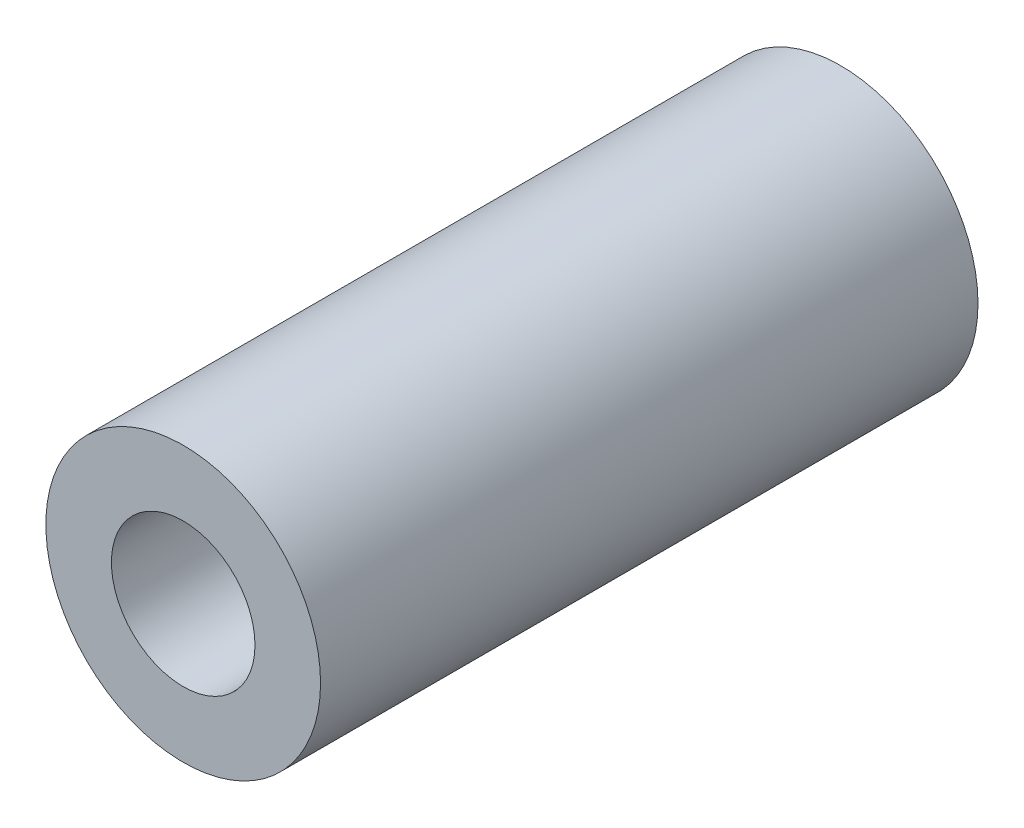
ISO-10303-21;
HEADER;
FILE_DESCRIPTION(('STEP AP214'),'2;1');
FILE_NAME('part.step','',(''),(''),'','','');
FILE_SCHEMA(('AUTOMOTIVE_DESIGN { 1 0 10303 214 1 1 1 1 }'));
ENDSEC;
DATA;
#1=APPLICATION_CONTEXT('core data for automotive mechanical design processes');
#2=APPLICATION_PROTOCOL_DEFINITION('international standard','automotive_design',2000,#1);
#3=PRODUCT_CONTEXT('',#1,'mechanical');
#4=PRODUCT('Part','Part','',(#3));
#5=PRODUCT_RELATED_PRODUCT_CATEGORY('part','',(#4));
#6=PRODUCT_DEFINITION_FORMATION('','',#4);
#7=PRODUCT_DEFINITION_CONTEXT('part definition',#1,'design');
#8=PRODUCT_DEFINITION('design','',#6,#7);
#9=PRODUCT_DEFINITION_SHAPE('','',#8);
#10=(LENGTH_UNIT() NAMED_UNIT(*) SI_UNIT(.MILLI.,.METRE.));
#11=(NAMED_UNIT(*) PLANE_ANGLE_UNIT() SI_UNIT($,.RADIAN.));
#12=(NAMED_UNIT(*) SI_UNIT($,.STERADIAN.) SOLID_ANGLE_UNIT());
#13=UNCERTAINTY_MEASURE_WITH_UNIT(LENGTH_MEASURE(1.E-05),#10,'distance_accuracy_value','');
#14=(GEOMETRIC_REPRESENTATION_CONTEXT(3) GLOBAL_UNCERTAINTY_ASSIGNED_CONTEXT((#13)) GLOBAL_UNIT_ASSIGNED_CONTEXT((#10,
#11,#12)) REPRESENTATION_CONTEXT('',''));
#15=CARTESIAN_POINT('',(0.,0.,0.));
#16=DIRECTION('',(0.,0.,1.));
#17=DIRECTION('',(1.,0.,0.));
#18=AXIS2_PLACEMENT_3D('',#15,#16,#17);
#19=CARTESIAN_POINT('',(0.,0.,11.39825));
#20=DIRECTION('',(0.,0.,1.));
#21=DIRECTION('',(1.,0.,0.));
#22=AXIS2_PLACEMENT_3D('',#19,#20,#21);
#23=PLANE('',#22);
#24=CARTESIAN_POINT('',(0.,0.,11.39825));
#25=DIRECTION('',(0.,0.,1.));
#26=DIRECTION('',(1.,0.,0.));
#27=AXIS2_PLACEMENT_3D('',#24,#25,#26);
#28=CIRCLE('',#27,4.7625);
#29=CARTESIAN_POINT('',(4.7625,0.,11.39825));
#30=VERTEX_POINT('',#29);
#31=EDGE_CURVE('E11',#30,#30,#28,.T.);
#32=ORIENTED_EDGE('',*,*,#31,.T.);
#33=EDGE_LOOP('',(#32));
#34=FACE_BOUND('',#33,.T.);
#35=CARTESIAN_POINT('',(0.,0.,11.39825));
#36=DIRECTION('',(0.,0.,1.));
#37=DIRECTION('',(1.,0.,0.));
#38=AXIS2_PLACEMENT_3D('',#35,#36,#37);
#39=CIRCLE('',#38,2.4892);
#40=CARTESIAN_POINT('',(2.4892,0.,11.39825));
#41=VERTEX_POINT('',#40);
#42=EDGE_CURVE('E62',#41,#41,#39,.T.);
#43=ORIENTED_EDGE('',*,*,#42,.F.);
#44=EDGE_LOOP('',(#43));
#45=FACE_BOUND('',#44,.T.);
#46=ADVANCED_FACE('F49',(#34,#45),#23,.T.);
#47=CARTESIAN_POINT('',(0.,0.,-11.39825));
#48=DIRECTION('',(0.,0.,1.));
#49=DIRECTION('',(1.,0.,0.));
#50=AXIS2_PLACEMENT_3D('',#47,#48,#49);
#51=PLANE('',#50);
#52=CARTESIAN_POINT('',(0.,0.,-11.39825));
#53=DIRECTION('',(0.,0.,1.));
#54=DIRECTION('',(1.,0.,0.));
#55=AXIS2_PLACEMENT_3D('',#52,#53,#54);
#56=CIRCLE('',#55,4.7625);
#57=CARTESIAN_POINT('',(4.7625,0.,-11.39825));
#58=VERTEX_POINT('',#57);
#59=EDGE_CURVE('E53',#58,#58,#56,.T.);
#60=ORIENTED_EDGE('',*,*,#59,.F.);
#61=EDGE_LOOP('',(#60));
#62=FACE_BOUND('',#61,.T.);
#63=CARTESIAN_POINT('',(0.,0.,-11.39825));
#64=DIRECTION('',(0.,0.,1.));
#65=DIRECTION('',(1.,0.,0.));
#66=AXIS2_PLACEMENT_3D('',#63,#64,#65);
#67=CIRCLE('',#66,2.4892);
#68=CARTESIAN_POINT('',(2.4892,0.,-11.39825));
#69=VERTEX_POINT('',#68);
#70=EDGE_CURVE('E64',#69,#69,#67,.T.);
#71=ORIENTED_EDGE('',*,*,#70,.T.);
#72=EDGE_LOOP('',(#71));
#73=FACE_BOUND('',#72,.T.);
#74=ADVANCED_FACE('F76',(#62,#73),#51,.F.);
#75=CARTESIAN_POINT('',(0.,0.,11.39825));
#76=DIRECTION('',(0.,0.,-1.));
#77=DIRECTION('',(-1.,0.,0.));
#78=AXIS2_PLACEMENT_3D('',#75,#76,#77);
#79=CYLINDRICAL_SURFACE('',#78,4.7625);
#80=ORIENTED_EDGE('',*,*,#31,.F.);
#81=EDGE_LOOP('',(#80));
#82=FACE_BOUND('',#81,.T.);
#83=ORIENTED_EDGE('',*,*,#59,.T.);
#84=EDGE_LOOP('',(#83));
#85=FACE_BOUND('',#84,.T.);
#86=ADVANCED_FACE('F51',(#82,#85),#79,.T.);
#87=CARTESIAN_POINT('',(0.,0.,11.39825));
#88=DIRECTION('',(0.,0.,-1.));
#89=DIRECTION('',(-1.,0.,0.));
#90=AXIS2_PLACEMENT_3D('',#87,#88,#89);
#91=CYLINDRICAL_SURFACE('',#90,2.4892);
#92=ORIENTED_EDGE('',*,*,#42,.T.);
#93=EDGE_LOOP('',(#92));
#94=FACE_BOUND('',#93,.T.);
#95=ORIENTED_EDGE('',*,*,#70,.F.);
#96=EDGE_LOOP('',(#95));
#97=FACE_BOUND('',#96,.T.);
#98=ADVANCED_FACE('F72',(#94,#97),#91,.F.);
#99=CLOSED_SHELL('',(#46,#74,#86,#98));
#100=MANIFOLD_SOLID_BREP('B2',#99);
#101=ADVANCED_BREP_SHAPE_REPRESENTATION('',(#18,#100),#14);
#102=SHAPE_DEFINITION_REPRESENTATION(#9,#101);
ENDSEC;
END-ISO-10303-21;
